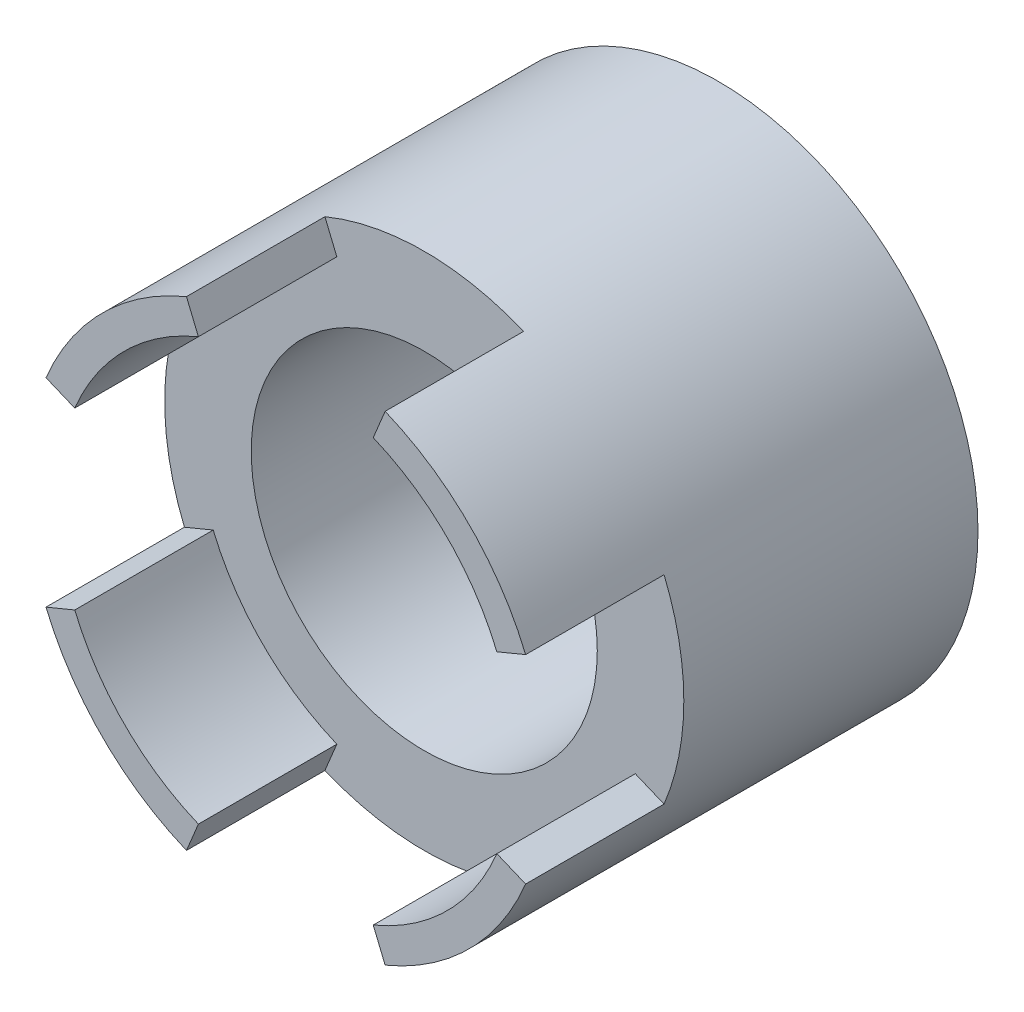
ISO-10303-21;
HEADER;
FILE_DESCRIPTION(('STEP AP214'),'2;1');
FILE_NAME('part.step','',(''),(''),'','','');
FILE_SCHEMA(('AUTOMOTIVE_DESIGN { 1 0 10303 214 1 1 1 1 }'));
ENDSEC;
DATA;
#1=APPLICATION_CONTEXT('core data for automotive mechanical design processes');
#2=APPLICATION_PROTOCOL_DEFINITION('international standard','automotive_design',2000,#1);
#3=PRODUCT_CONTEXT('',#1,'mechanical');
#4=PRODUCT('Part','Part','',(#3));
#5=PRODUCT_RELATED_PRODUCT_CATEGORY('part','',(#4));
#6=PRODUCT_DEFINITION_FORMATION('','',#4);
#7=PRODUCT_DEFINITION_CONTEXT('part definition',#1,'design');
#8=PRODUCT_DEFINITION('design','',#6,#7);
#9=PRODUCT_DEFINITION_SHAPE('','',#8);
#10=(LENGTH_UNIT() NAMED_UNIT(*) SI_UNIT(.MILLI.,.METRE.));
#11=(NAMED_UNIT(*) PLANE_ANGLE_UNIT() SI_UNIT($,.RADIAN.));
#12=(NAMED_UNIT(*) SI_UNIT($,.STERADIAN.) SOLID_ANGLE_UNIT());
#13=UNCERTAINTY_MEASURE_WITH_UNIT(LENGTH_MEASURE(1.E-05),#10,'distance_accuracy_value','');
#14=(GEOMETRIC_REPRESENTATION_CONTEXT(3) GLOBAL_UNCERTAINTY_ASSIGNED_CONTEXT((#13)) GLOBAL_UNIT_ASSIGNED_CONTEXT((#10,
#11,#12)) REPRESENTATION_CONTEXT('',''));
#15=CARTESIAN_POINT('',(0.,0.,0.));
#16=DIRECTION('',(0.,0.,1.));
#17=DIRECTION('',(1.,0.,0.));
#18=AXIS2_PLACEMENT_3D('',#15,#16,#17);
#19=CARTESIAN_POINT('',(0.,0.,-31.75));
#20=DIRECTION('',(0.,0.,1.));
#21=DIRECTION('',(1.,0.,0.));
#22=AXIS2_PLACEMENT_3D('',#19,#20,#21);
#23=CYLINDRICAL_SURFACE('',#22,16.764);
#24=CARTESIAN_POINT('',(0.,0.,0.));
#25=DIRECTION('',(0.,0.,1.));
#26=DIRECTION('',(1.,0.,0.));
#27=AXIS2_PLACEMENT_3D('',#24,#25,#26);
#28=CIRCLE('',#27,16.764);
#29=CARTESIAN_POINT('',(15.4879164830192,6.41530506016833,0.));
#30=VERTEX_POINT('',#29);
#31=CARTESIAN_POINT('',(6.41530506016838,15.4879164830192,0.));
#32=VERTEX_POINT('',#31);
#33=EDGE_CURVE('E305',#30,#32,#28,.T.);
#34=ORIENTED_EDGE('',*,*,#33,.T.);
#35=DIRECTION('',(0.,0.,1.));
#36=VECTOR('',#35,1.);
#37=CARTESIAN_POINT('',(6.41530506016838,15.4879164830192,-10.16));
#38=LINE('',#37,#36);
#39=CARTESIAN_POINT('',(6.41530506016838,15.4879164830192,-10.16));
#40=VERTEX_POINT('',#39);
#41=EDGE_CURVE('E188',#40,#32,#38,.T.);
#42=ORIENTED_EDGE('',*,*,#41,.F.);
#43=CARTESIAN_POINT('',(0.,0.,-10.16));
#44=DIRECTION('',(0.,0.,1.));
#45=DIRECTION('',(1.,0.,0.));
#46=AXIS2_PLACEMENT_3D('',#43,#44,#45);
#47=CIRCLE('',#46,16.764);
#48=CARTESIAN_POINT('',(15.4879164830192,6.41530506016834,-10.16));
#49=VERTEX_POINT('',#48);
#50=EDGE_CURVE('E292',#49,#40,#47,.T.);
#51=ORIENTED_EDGE('',*,*,#50,.F.);
#52=DIRECTION('',(0.,0.,1.));
#53=VECTOR('',#52,1.);
#54=CARTESIAN_POINT('',(15.4879164830192,6.41530506016833,-10.16));
#55=LINE('',#54,#53);
#56=EDGE_CURVE('E220',#49,#30,#55,.T.);
#57=ORIENTED_EDGE('',*,*,#56,.T.);
#58=EDGE_LOOP('',(#34,#42,#51,#57));
#59=FACE_BOUND('',#58,.T.);
#60=ADVANCED_FACE('F41',(#59),#23,.F.);
#61=CARTESIAN_POINT('',(6.41530506016828,-15.4879164830193,0.));
#62=VERTEX_POINT('',#61);
#63=CARTESIAN_POINT('',(15.4879164830192,-6.41530506016843,0.));
#64=VERTEX_POINT('',#63);
#65=EDGE_CURVE('E295',#62,#64,#28,.T.);
#66=ORIENTED_EDGE('',*,*,#65,.T.);
#67=DIRECTION('',(0.,0.,1.));
#68=VECTOR('',#67,1.);
#69=CARTESIAN_POINT('',(15.4879164830192,-6.41530506016843,-10.16));
#70=LINE('',#69,#68);
#71=CARTESIAN_POINT('',(15.4879164830192,-6.41530506016843,-10.16));
#72=VERTEX_POINT('',#71);
#73=EDGE_CURVE('E217',#72,#64,#70,.T.);
#74=ORIENTED_EDGE('',*,*,#73,.F.);
#75=CARTESIAN_POINT('',(6.41530506016829,-15.4879164830192,-10.16));
#76=VERTEX_POINT('',#75);
#77=EDGE_CURVE('E286',#76,#72,#47,.T.);
#78=ORIENTED_EDGE('',*,*,#77,.F.);
#79=DIRECTION('',(0.,0.,1.));
#80=VECTOR('',#79,1.);
#81=CARTESIAN_POINT('',(6.41530506016828,-15.4879164830193,-10.16));
#82=LINE('',#81,#80);
#83=EDGE_CURVE('E249',#76,#62,#82,.T.);
#84=ORIENTED_EDGE('',*,*,#83,.T.);
#85=EDGE_LOOP('',(#66,#74,#78,#84));
#86=FACE_BOUND('',#85,.T.);
#87=ADVANCED_FACE('F351',(#86),#23,.F.);
#88=CARTESIAN_POINT('',(-15.4879164830193,-6.41530506016822,0.));
#89=VERTEX_POINT('',#88);
#90=CARTESIAN_POINT('',(-6.41530506016848,-15.4879164830192,0.));
#91=VERTEX_POINT('',#90);
#92=EDGE_CURVE('E357',#89,#91,#28,.T.);
#93=ORIENTED_EDGE('',*,*,#92,.T.);
#94=DIRECTION('',(0.,0.,1.));
#95=VECTOR('',#94,1.);
#96=CARTESIAN_POINT('',(-6.41530506016848,-15.4879164830192,-10.16));
#97=LINE('',#96,#95);
#98=CARTESIAN_POINT('',(-6.41530506016848,-15.4879164830192,-10.16));
#99=VERTEX_POINT('',#98);
#100=EDGE_CURVE('E246',#99,#91,#97,.T.);
#101=ORIENTED_EDGE('',*,*,#100,.F.);
#102=CARTESIAN_POINT('',(-15.4879164830193,-6.41530506016823,-10.16));
#103=VERTEX_POINT('',#102);
#104=EDGE_CURVE('E341',#103,#99,#47,.T.);
#105=ORIENTED_EDGE('',*,*,#104,.F.);
#106=DIRECTION('',(0.,0.,1.));
#107=VECTOR('',#106,1.);
#108=CARTESIAN_POINT('',(-15.4879164830193,-6.41530506016822,-10.16));
#109=LINE('',#108,#107);
#110=EDGE_CURVE('E276',#103,#89,#109,.T.);
#111=ORIENTED_EDGE('',*,*,#110,.T.);
#112=EDGE_LOOP('',(#93,#101,#105,#111));
#113=FACE_BOUND('',#112,.T.);
#114=ADVANCED_FACE('F387',(#113),#23,.F.);
#115=CARTESIAN_POINT('',(0.,0.,0.));
#116=DIRECTION('',(0.,0.,1.));
#117=DIRECTION('',(1.,0.,0.));
#118=AXIS2_PLACEMENT_3D('',#115,#116,#117);
#119=PLANE('',#118);
#120=DIRECTION('',(0.38268343236509,0.923879532511286,0.));
#121=VECTOR('',#120,1.);
#122=CARTESIAN_POINT('',(7.29011938655497,17.59990509434,0.));
#123=LINE('',#122,#121);
#124=CARTESIAN_POINT('',(7.29011938655497,17.59990509434,0.));
#125=VERTEX_POINT('',#124);
#126=EDGE_CURVE('E176',#32,#125,#123,.T.);
#127=ORIENTED_EDGE('',*,*,#126,.F.);
#128=ORIENTED_EDGE('',*,*,#33,.F.);
#129=DIRECTION('',(-0.923879532511287,-0.382683432365088,0.));
#130=VECTOR('',#129,1.);
#131=CARTESIAN_POINT('',(17.59990509434,7.29011938655492,0.));
#132=LINE('',#131,#130);
#133=CARTESIAN_POINT('',(17.59990509434,7.29011938655492,0.));
#134=VERTEX_POINT('',#133);
#135=EDGE_CURVE('E206',#134,#30,#132,.T.);
#136=ORIENTED_EDGE('',*,*,#135,.F.);
#137=CARTESIAN_POINT('',(0.,0.,0.));
#138=DIRECTION('',(0.,0.,1.));
#139=DIRECTION('',(1.,0.,0.));
#140=AXIS2_PLACEMENT_3D('',#137,#138,#139);
#141=CIRCLE('',#140,19.05);
#142=EDGE_CURVE('E301',#134,#125,#141,.T.);
#143=ORIENTED_EDGE('',*,*,#142,.T.);
#144=EDGE_LOOP('',(#127,#128,#136,#143));
#145=FACE_BOUND('',#144,.T.);
#146=ADVANCED_FACE('F403',(#145),#119,.T.);
#147=DIRECTION('',(0.923879532511285,-0.382683432365094,0.));
#148=VECTOR('',#147,1.);
#149=CARTESIAN_POINT('',(17.59990509434,-7.29011938655504,0.));
#150=LINE('',#149,#148);
#151=CARTESIAN_POINT('',(17.59990509434,-7.29011938655504,0.));
#152=VERTEX_POINT('',#151);
#153=EDGE_CURVE('E198',#64,#152,#150,.T.);
#154=ORIENTED_EDGE('',*,*,#153,.F.);
#155=ORIENTED_EDGE('',*,*,#65,.F.);
#156=DIRECTION('',(-0.382683432365085,0.923879532511289,0.));
#157=VECTOR('',#156,1.);
#158=CARTESIAN_POINT('',(7.29011938655486,-17.5999050943401,0.));
#159=LINE('',#158,#157);
#160=CARTESIAN_POINT('',(7.29011938655486,-17.5999050943401,0.));
#161=VERTEX_POINT('',#160);
#162=EDGE_CURVE('E237',#161,#62,#159,.T.);
#163=ORIENTED_EDGE('',*,*,#162,.F.);
#164=EDGE_CURVE('E308',#161,#152,#141,.T.);
#165=ORIENTED_EDGE('',*,*,#164,.T.);
#166=EDGE_LOOP('',(#154,#155,#163,#165));
#167=FACE_BOUND('',#166,.T.);
#168=ADVANCED_FACE('F355',(#167),#119,.T.);
#169=DIRECTION('',(-0.382683432365097,-0.923879532511284,0.));
#170=VECTOR('',#169,1.);
#171=CARTESIAN_POINT('',(-7.2901193865551,-17.59990509434,0.));
#172=LINE('',#171,#170);
#173=CARTESIAN_POINT('',(-7.2901193865551,-17.59990509434,0.));
#174=VERTEX_POINT('',#173);
#175=EDGE_CURVE('E229',#91,#174,#172,.T.);
#176=ORIENTED_EDGE('',*,*,#175,.F.);
#177=ORIENTED_EDGE('',*,*,#92,.F.);
#178=DIRECTION('',(0.92387953251129,0.382683432365082,0.));
#179=VECTOR('',#178,1.);
#180=CARTESIAN_POINT('',(-17.5999050943401,-7.29011938655479,0.));
#181=LINE('',#180,#179);
#182=CARTESIAN_POINT('',(-17.5999050943401,-7.29011938655479,0.));
#183=VERTEX_POINT('',#182);
#184=EDGE_CURVE('E266',#183,#89,#181,.T.);
#185=ORIENTED_EDGE('',*,*,#184,.F.);
#186=EDGE_CURVE('E317',#183,#174,#141,.T.);
#187=ORIENTED_EDGE('',*,*,#186,.T.);
#188=EDGE_LOOP('',(#176,#177,#185,#187));
#189=FACE_BOUND('',#188,.T.);
#190=ADVANCED_FACE('F330',(#189),#119,.T.);
#191=CARTESIAN_POINT('',(0.,0.,-31.75));
#192=DIRECTION('',(0.,0.,1.));
#193=DIRECTION('',(1.,0.,0.));
#194=AXIS2_PLACEMENT_3D('',#191,#192,#193);
#195=CIRCLE('',#194,16.764);
#196=CARTESIAN_POINT('',(16.764,0.,-31.75));
#197=VERTEX_POINT('',#196);
#198=EDGE_CURVE('E297',#197,#197,#195,.T.);
#199=ORIENTED_EDGE('',*,*,#198,.F.);
#200=EDGE_LOOP('',(#199));
#201=FACE_BOUND('',#200,.T.);
#202=CARTESIAN_POINT('',(0.,0.,-30.48));
#203=DIRECTION('',(0.,0.,1.));
#204=DIRECTION('',(1.,0.,0.));
#205=AXIS2_PLACEMENT_3D('',#202,#203,#204);
#206=CIRCLE('',#205,16.764);
#207=CARTESIAN_POINT('',(16.764,0.,-30.48));
#208=VERTEX_POINT('',#207);
#209=EDGE_CURVE('E11',#208,#208,#206,.F.);
#210=ORIENTED_EDGE('',*,*,#209,.F.);
#211=EDGE_LOOP('',(#210));
#212=FACE_BOUND('',#211,.T.);
#213=ADVANCED_FACE('F389',(#201,#212),#23,.F.);
#214=CARTESIAN_POINT('',(-6.4153050601684,15.4879164830192,-10.16));
#215=VERTEX_POINT('',#214);
#216=CARTESIAN_POINT('',(-15.4879164830191,6.41530506016854,-10.16));
#217=VERTEX_POINT('',#216);
#218=EDGE_CURVE('E296',#215,#217,#47,.T.);
#219=ORIENTED_EDGE('',*,*,#218,.F.);
#220=DIRECTION('',(0.,0.,1.));
#221=VECTOR('',#220,1.);
#222=CARTESIAN_POINT('',(-6.41530506016838,15.4879164830192,-10.16));
#223=LINE('',#222,#221);
#224=CARTESIAN_POINT('',(-6.41530506016838,15.4879164830192,0.));
#225=VERTEX_POINT('',#224);
#226=EDGE_CURVE('E162',#215,#225,#223,.T.);
#227=ORIENTED_EDGE('',*,*,#226,.T.);
#228=CARTESIAN_POINT('',(-15.4879164830191,6.41530506016854,0.));
#229=VERTEX_POINT('',#228);
#230=EDGE_CURVE('E309',#225,#229,#28,.T.);
#231=ORIENTED_EDGE('',*,*,#230,.T.);
#232=DIRECTION('',(0.,0.,1.));
#233=VECTOR('',#232,1.);
#234=CARTESIAN_POINT('',(-15.4879164830191,6.41530506016854,-10.16));
#235=LINE('',#234,#233);
#236=EDGE_CURVE('E273',#217,#229,#235,.T.);
#237=ORIENTED_EDGE('',*,*,#236,.F.);
#238=EDGE_LOOP('',(#219,#227,#231,#237));
#239=FACE_BOUND('',#238,.T.);
#240=ADVANCED_FACE('F43',(#239),#23,.F.);
#241=CARTESIAN_POINT('',(0.,0.,-31.75));
#242=DIRECTION('',(0.,0.,1.));
#243=DIRECTION('',(1.,0.,0.));
#244=AXIS2_PLACEMENT_3D('',#241,#242,#243);
#245=CYLINDRICAL_SURFACE('',#244,19.05);
#246=DIRECTION('',(0.,0.,1.));
#247=VECTOR('',#246,1.);
#248=CARTESIAN_POINT('',(7.29011938655497,17.59990509434,-10.16));
#249=LINE('',#248,#247);
#250=CARTESIAN_POINT('',(7.29011938655497,17.59990509434,-10.16));
#251=VERTEX_POINT('',#250);
#252=EDGE_CURVE('E291',#251,#125,#249,.T.);
#253=ORIENTED_EDGE('',*,*,#252,.T.);
#254=ORIENTED_EDGE('',*,*,#142,.F.);
#255=DIRECTION('',(0.,0.,1.));
#256=VECTOR('',#255,1.);
#257=CARTESIAN_POINT('',(17.59990509434,7.29011938655492,-10.16));
#258=LINE('',#257,#256);
#259=CARTESIAN_POINT('',(17.59990509434,7.29011938655492,-10.16));
#260=VERTEX_POINT('',#259);
#261=EDGE_CURVE('E205',#260,#134,#258,.T.);
#262=ORIENTED_EDGE('',*,*,#261,.F.);
#263=CARTESIAN_POINT('',(0.,0.,-10.16));
#264=DIRECTION('',(0.,0.,1.));
#265=DIRECTION('',(-1.,0.,0.));
#266=AXIS2_PLACEMENT_3D('',#263,#264,#265);
#267=CIRCLE('',#266,19.05);
#268=CARTESIAN_POINT('',(17.59990509434,-7.29011938655504,-10.16));
#269=VERTEX_POINT('',#268);
#270=EDGE_CURVE('E193',#269,#260,#267,.T.);
#271=ORIENTED_EDGE('',*,*,#270,.F.);
#272=DIRECTION('',(0.,0.,1.));
#273=VECTOR('',#272,1.);
#274=CARTESIAN_POINT('',(17.59990509434,-7.29011938655504,-10.16));
#275=LINE('',#274,#273);
#276=EDGE_CURVE('E212',#269,#152,#275,.T.);
#277=ORIENTED_EDGE('',*,*,#276,.T.);
#278=ORIENTED_EDGE('',*,*,#164,.F.);
#279=DIRECTION('',(0.,0.,1.));
#280=VECTOR('',#279,1.);
#281=CARTESIAN_POINT('',(7.29011938655486,-17.5999050943401,-10.16));
#282=LINE('',#281,#280);
#283=CARTESIAN_POINT('',(7.29011938655486,-17.5999050943401,-10.16));
#284=VERTEX_POINT('',#283);
#285=EDGE_CURVE('E236',#284,#161,#282,.T.);
#286=ORIENTED_EDGE('',*,*,#285,.F.);
#287=CARTESIAN_POINT('',(0.,0.,-10.16));
#288=DIRECTION('',(0.,0.,1.));
#289=DIRECTION('',(-1.,0.,0.));
#290=AXIS2_PLACEMENT_3D('',#287,#288,#289);
#291=CIRCLE('',#290,19.05);
#292=CARTESIAN_POINT('',(-7.2901193865551,-17.59990509434,-10.16));
#293=VERTEX_POINT('',#292);
#294=EDGE_CURVE('E226',#293,#284,#291,.T.);
#295=ORIENTED_EDGE('',*,*,#294,.F.);
#296=DIRECTION('',(0.,0.,1.));
#297=VECTOR('',#296,1.);
#298=CARTESIAN_POINT('',(-7.2901193865551,-17.59990509434,-10.16));
#299=LINE('',#298,#297);
#300=EDGE_CURVE('E209',#293,#174,#299,.T.);
#301=ORIENTED_EDGE('',*,*,#300,.T.);
#302=ORIENTED_EDGE('',*,*,#186,.F.);
#303=DIRECTION('',(0.,0.,1.));
#304=VECTOR('',#303,1.);
#305=CARTESIAN_POINT('',(-17.5999050943401,-7.29011938655479,-10.16));
#306=LINE('',#305,#304);
#307=CARTESIAN_POINT('',(-17.5999050943401,-7.29011938655479,-10.16));
#308=VERTEX_POINT('',#307);
#309=EDGE_CURVE('E265',#308,#183,#306,.T.);
#310=ORIENTED_EDGE('',*,*,#309,.F.);
#311=CARTESIAN_POINT('',(0.,0.,-10.16));
#312=DIRECTION('',(0.,0.,1.));
#313=DIRECTION('',(-1.,0.,0.));
#314=AXIS2_PLACEMENT_3D('',#311,#312,#313);
#315=CIRCLE('',#314,19.05);
#316=CARTESIAN_POINT('',(-17.5999050943399,7.29011938655516,-10.16));
#317=VERTEX_POINT('',#316);
#318=EDGE_CURVE('E255',#317,#308,#315,.T.);
#319=ORIENTED_EDGE('',*,*,#318,.F.);
#320=DIRECTION('',(0.,0.,1.));
#321=VECTOR('',#320,1.);
#322=CARTESIAN_POINT('',(-17.5999050943399,7.29011938655516,-10.16));
#323=LINE('',#322,#321);
#324=CARTESIAN_POINT('',(-17.5999050943399,7.29011938655516,0.));
#325=VERTEX_POINT('',#324);
#326=EDGE_CURVE('E240',#317,#325,#323,.T.);
#327=ORIENTED_EDGE('',*,*,#326,.T.);
#328=CARTESIAN_POINT('',(-7.29011938655498,17.59990509434,0.));
#329=VERTEX_POINT('',#328);
#330=EDGE_CURVE('E183',#329,#325,#141,.T.);
#331=ORIENTED_EDGE('',*,*,#330,.F.);
#332=DIRECTION('',(0.,0.,1.));
#333=VECTOR('',#332,1.);
#334=CARTESIAN_POINT('',(-7.29011938655498,17.59990509434,-10.16));
#335=LINE('',#334,#333);
#336=CARTESIAN_POINT('',(-7.29011938655498,17.59990509434,-10.16));
#337=VERTEX_POINT('',#336);
#338=EDGE_CURVE('E159',#337,#329,#335,.T.);
#339=ORIENTED_EDGE('',*,*,#338,.F.);
#340=CARTESIAN_POINT('',(0.,0.,-10.16));
#341=DIRECTION('',(0.,0.,1.));
#342=DIRECTION('',(-1.,0.,0.));
#343=AXIS2_PLACEMENT_3D('',#340,#341,#342);
#344=CIRCLE('',#343,19.05);
#345=EDGE_CURVE('E167',#251,#337,#344,.T.);
#346=ORIENTED_EDGE('',*,*,#345,.F.);
#347=EDGE_LOOP('',(#253,#254,#262,#271,#277,#278,#286,#295,#301,#302,#310,#319,#327,#331,#339,#346));
#348=FACE_BOUND('',#347,.T.);
#349=CARTESIAN_POINT('',(0.,0.,-31.75));
#350=DIRECTION('',(0.,0.,1.));
#351=DIRECTION('',(1.,0.,0.));
#352=AXIS2_PLACEMENT_3D('',#349,#350,#351);
#353=CIRCLE('',#352,19.05);
#354=CARTESIAN_POINT('',(19.05,0.,-31.75));
#355=VERTEX_POINT('',#354);
#356=EDGE_CURVE('E50',#355,#355,#353,.T.);
#357=ORIENTED_EDGE('',*,*,#356,.T.);
#358=EDGE_LOOP('',(#357));
#359=FACE_BOUND('',#358,.T.);
#360=ADVANCED_FACE('F179',(#348,#359),#245,.T.);
#361=CARTESIAN_POINT('',(0.,0.,-31.75));
#362=DIRECTION('',(0.,0.,1.));
#363=DIRECTION('',(1.,0.,0.));
#364=AXIS2_PLACEMENT_3D('',#361,#362,#363);
#365=PLANE('',#364);
#366=ORIENTED_EDGE('',*,*,#198,.T.);
#367=EDGE_LOOP('',(#366));
#368=FACE_BOUND('',#367,.T.);
#369=ORIENTED_EDGE('',*,*,#356,.F.);
#370=EDGE_LOOP('',(#369));
#371=FACE_BOUND('',#370,.T.);
#372=ADVANCED_FACE('F394',(#368,#371),#365,.F.);
#373=DIRECTION('',(0.382683432365092,-0.923879532511286,0.));
#374=VECTOR('',#373,1.);
#375=CARTESIAN_POINT('',(-7.29011938655498,17.59990509434,0.));
#376=LINE('',#375,#374);
#377=EDGE_CURVE('E216',#329,#225,#376,.T.);
#378=ORIENTED_EDGE('',*,*,#377,.F.);
#379=ORIENTED_EDGE('',*,*,#330,.T.);
#380=DIRECTION('',(-0.923879532511283,0.3826834323651,0.));
#381=VECTOR('',#380,1.);
#382=CARTESIAN_POINT('',(-17.5999050943399,7.29011938655516,0.));
#383=LINE('',#382,#381);
#384=EDGE_CURVE('E258',#229,#325,#383,.T.);
#385=ORIENTED_EDGE('',*,*,#384,.F.);
#386=ORIENTED_EDGE('',*,*,#230,.F.);
#387=EDGE_LOOP('',(#378,#379,#385,#386));
#388=FACE_BOUND('',#387,.T.);
#389=ADVANCED_FACE('F366',(#388),#119,.T.);
#390=CARTESIAN_POINT('',(0.,0.,-30.48));
#391=DIRECTION('',(0.,0.,1.));
#392=DIRECTION('',(1.,0.,0.));
#393=AXIS2_PLACEMENT_3D('',#390,#391,#392);
#394=PLANE('',#393);
#395=CARTESIAN_POINT('',(0.,0.,-30.48));
#396=DIRECTION('',(0.,0.,1.));
#397=DIRECTION('',(1.,0.,0.));
#398=AXIS2_PLACEMENT_3D('',#395,#396,#397);
#399=CIRCLE('',#398,12.7);
#400=CARTESIAN_POINT('',(12.7,0.,-30.48));
#401=VERTEX_POINT('',#400);
#402=EDGE_CURVE('E282',#401,#401,#399,.T.);
#403=ORIENTED_EDGE('',*,*,#402,.T.);
#404=EDGE_LOOP('',(#403));
#405=FACE_BOUND('',#404,.T.);
#406=ORIENTED_EDGE('',*,*,#209,.T.);
#407=EDGE_LOOP('',(#406));
#408=FACE_BOUND('',#407,.T.);
#409=ADVANCED_FACE('F412',(#405,#408),#394,.F.);
#410=CARTESIAN_POINT('',(0.,0.,-10.16));
#411=DIRECTION('',(0.,0.,1.));
#412=DIRECTION('',(1.,0.,0.));
#413=AXIS2_PLACEMENT_3D('',#410,#411,#412);
#414=PLANE('',#413);
#415=CARTESIAN_POINT('',(0.,0.,-10.16));
#416=DIRECTION('',(0.,0.,1.));
#417=DIRECTION('',(1.,0.,0.));
#418=AXIS2_PLACEMENT_3D('',#415,#416,#417);
#419=CIRCLE('',#418,12.7);
#420=CARTESIAN_POINT('',(12.7,0.,-10.16));
#421=VERTEX_POINT('',#420);
#422=EDGE_CURVE('E287',#421,#421,#419,.T.);
#423=ORIENTED_EDGE('',*,*,#422,.F.);
#424=EDGE_LOOP('',(#423));
#425=FACE_BOUND('',#424,.T.);
#426=ORIENTED_EDGE('',*,*,#50,.T.);
#427=DIRECTION('',(0.38268343236509,0.923879532511286,0.));
#428=VECTOR('',#427,1.);
#429=CARTESIAN_POINT('',(7.29011938655497,17.59990509434,-10.16));
#430=LINE('',#429,#428);
#431=EDGE_CURVE('E166',#40,#251,#430,.T.);
#432=ORIENTED_EDGE('',*,*,#431,.T.);
#433=ORIENTED_EDGE('',*,*,#345,.T.);
#434=DIRECTION('',(0.382683432365092,-0.923879532511286,0.));
#435=VECTOR('',#434,1.);
#436=CARTESIAN_POINT('',(-7.29011938655498,17.59990509434,-10.16));
#437=LINE('',#436,#435);
#438=EDGE_CURVE('E155',#337,#215,#437,.T.);
#439=ORIENTED_EDGE('',*,*,#438,.T.);
#440=ORIENTED_EDGE('',*,*,#218,.T.);
#441=DIRECTION('',(-0.923879532511283,0.3826834323651,0.));
#442=VECTOR('',#441,1.);
#443=CARTESIAN_POINT('',(-17.5999050943399,7.29011938655516,-10.16));
#444=LINE('',#443,#442);
#445=EDGE_CURVE('E261',#217,#317,#444,.T.);
#446=ORIENTED_EDGE('',*,*,#445,.T.);
#447=ORIENTED_EDGE('',*,*,#318,.T.);
#448=DIRECTION('',(0.92387953251129,0.382683432365082,0.));
#449=VECTOR('',#448,1.);
#450=CARTESIAN_POINT('',(-17.5999050943401,-7.29011938655479,-10.16));
#451=LINE('',#450,#449);
#452=EDGE_CURVE('E64',#308,#103,#451,.T.);
#453=ORIENTED_EDGE('',*,*,#452,.T.);
#454=ORIENTED_EDGE('',*,*,#104,.T.);
#455=DIRECTION('',(-0.382683432365097,-0.923879532511284,0.));
#456=VECTOR('',#455,1.);
#457=CARTESIAN_POINT('',(-7.2901193865551,-17.59990509434,-10.16));
#458=LINE('',#457,#456);
#459=EDGE_CURVE('E232',#99,#293,#458,.T.);
#460=ORIENTED_EDGE('',*,*,#459,.T.);
#461=ORIENTED_EDGE('',*,*,#294,.T.);
#462=DIRECTION('',(-0.382683432365085,0.923879532511289,0.));
#463=VECTOR('',#462,1.);
#464=CARTESIAN_POINT('',(7.29011938655486,-17.5999050943401,-10.16));
#465=LINE('',#464,#463);
#466=EDGE_CURVE('E57',#284,#76,#465,.T.);
#467=ORIENTED_EDGE('',*,*,#466,.T.);
#468=ORIENTED_EDGE('',*,*,#77,.T.);
#469=DIRECTION('',(0.923879532511285,-0.382683432365094,0.));
#470=VECTOR('',#469,1.);
#471=CARTESIAN_POINT('',(17.59990509434,-7.29011938655504,-10.16));
#472=LINE('',#471,#470);
#473=EDGE_CURVE('E201',#72,#269,#472,.T.);
#474=ORIENTED_EDGE('',*,*,#473,.T.);
#475=ORIENTED_EDGE('',*,*,#270,.T.);
#476=DIRECTION('',(-0.923879532511287,-0.382683432365088,0.));
#477=VECTOR('',#476,1.);
#478=CARTESIAN_POINT('',(17.59990509434,7.29011938655492,-10.16));
#479=LINE('',#478,#477);
#480=EDGE_CURVE('E197',#260,#49,#479,.T.);
#481=ORIENTED_EDGE('',*,*,#480,.T.);
#482=EDGE_LOOP('',(#426,#432,#433,#439,#440,#446,#447,#453,#454,#460,#461,#467,#468,#474,#475,#481));
#483=FACE_BOUND('',#482,.T.);
#484=ADVANCED_FACE('F172',(#425,#483),#414,.T.);
#485=CARTESIAN_POINT('',(0.,0.,-30.48));
#486=DIRECTION('',(0.,0.,1.));
#487=DIRECTION('',(1.,0.,0.));
#488=AXIS2_PLACEMENT_3D('',#485,#486,#487);
#489=CYLINDRICAL_SURFACE('',#488,12.7);
#490=ORIENTED_EDGE('',*,*,#402,.F.);
#491=EDGE_LOOP('',(#490));
#492=FACE_BOUND('',#491,.T.);
#493=ORIENTED_EDGE('',*,*,#422,.T.);
#494=EDGE_LOOP('',(#493));
#495=FACE_BOUND('',#494,.T.);
#496=ADVANCED_FACE('F371',(#492,#495),#489,.F.);
#497=CARTESIAN_POINT('',(-17.5999050943399,7.29011938655516,-10.16));
#498=DIRECTION('',(0.3826834323651,0.923879532511282,0.));
#499=DIRECTION('',(-0.923879532511282,0.3826834323651,0.));
#500=AXIS2_PLACEMENT_3D('',#497,#498,#499);
#501=PLANE('',#500);
#502=ORIENTED_EDGE('',*,*,#384,.T.);
#503=ORIENTED_EDGE('',*,*,#326,.F.);
#504=ORIENTED_EDGE('',*,*,#445,.F.);
#505=ORIENTED_EDGE('',*,*,#236,.T.);
#506=EDGE_LOOP('',(#502,#503,#504,#505));
#507=FACE_BOUND('',#506,.T.);
#508=ADVANCED_FACE('F368',(#507),#501,.F.);
#509=CARTESIAN_POINT('',(-17.5999050943401,-7.29011938655479,-10.16));
#510=DIRECTION('',(0.382683432365082,-0.92387953251129,0.));
#511=DIRECTION('',(0.92387953251129,0.382683432365082,0.));
#512=AXIS2_PLACEMENT_3D('',#509,#510,#511);
#513=PLANE('',#512);
#514=ORIENTED_EDGE('',*,*,#184,.T.);
#515=ORIENTED_EDGE('',*,*,#110,.F.);
#516=ORIENTED_EDGE('',*,*,#452,.F.);
#517=ORIENTED_EDGE('',*,*,#309,.T.);
#518=EDGE_LOOP('',(#514,#515,#516,#517));
#519=FACE_BOUND('',#518,.T.);
#520=ADVANCED_FACE('F370',(#519),#513,.F.);
#521=CARTESIAN_POINT('',(-7.2901193865551,-17.59990509434,-10.16));
#522=DIRECTION('',(-0.923879532511284,0.382683432365097,0.));
#523=DIRECTION('',(-0.382683432365097,-0.923879532511284,0.));
#524=AXIS2_PLACEMENT_3D('',#521,#522,#523);
#525=PLANE('',#524);
#526=ORIENTED_EDGE('',*,*,#175,.T.);
#527=ORIENTED_EDGE('',*,*,#300,.F.);
#528=ORIENTED_EDGE('',*,*,#459,.F.);
#529=ORIENTED_EDGE('',*,*,#100,.T.);
#530=EDGE_LOOP('',(#526,#527,#528,#529));
#531=FACE_BOUND('',#530,.T.);
#532=ADVANCED_FACE('F338',(#531),#525,.F.);
#533=CARTESIAN_POINT('',(7.29011938655486,-17.5999050943401,-10.16));
#534=DIRECTION('',(0.923879532511289,0.382683432365085,0.));
#535=DIRECTION('',(-0.382683432365085,0.923879532511289,0.));
#536=AXIS2_PLACEMENT_3D('',#533,#534,#535);
#537=PLANE('',#536);
#538=ORIENTED_EDGE('',*,*,#162,.T.);
#539=ORIENTED_EDGE('',*,*,#83,.F.);
#540=ORIENTED_EDGE('',*,*,#466,.F.);
#541=ORIENTED_EDGE('',*,*,#285,.T.);
#542=EDGE_LOOP('',(#538,#539,#540,#541));
#543=FACE_BOUND('',#542,.T.);
#544=ADVANCED_FACE('F515',(#543),#537,.F.);
#545=CARTESIAN_POINT('',(17.59990509434,-7.29011938655504,-10.16));
#546=DIRECTION('',(-0.382683432365094,-0.923879532511285,0.));
#547=DIRECTION('',(0.923879532511285,-0.382683432365094,0.));
#548=AXIS2_PLACEMENT_3D('',#545,#546,#547);
#549=PLANE('',#548);
#550=ORIENTED_EDGE('',*,*,#153,.T.);
#551=ORIENTED_EDGE('',*,*,#276,.F.);
#552=ORIENTED_EDGE('',*,*,#473,.F.);
#553=ORIENTED_EDGE('',*,*,#73,.T.);
#554=EDGE_LOOP('',(#550,#551,#552,#553));
#555=FACE_BOUND('',#554,.T.);
#556=ADVANCED_FACE('F354',(#555),#549,.F.);
#557=CARTESIAN_POINT('',(17.59990509434,7.29011938655492,-10.16));
#558=DIRECTION('',(-0.382683432365088,0.923879532511287,0.));
#559=DIRECTION('',(-0.923879532511287,-0.382683432365088,0.));
#560=AXIS2_PLACEMENT_3D('',#557,#558,#559);
#561=PLANE('',#560);
#562=ORIENTED_EDGE('',*,*,#135,.T.);
#563=ORIENTED_EDGE('',*,*,#56,.F.);
#564=ORIENTED_EDGE('',*,*,#480,.F.);
#565=ORIENTED_EDGE('',*,*,#261,.T.);
#566=EDGE_LOOP('',(#562,#563,#564,#565));
#567=FACE_BOUND('',#566,.T.);
#568=ADVANCED_FACE('F530',(#567),#561,.F.);
#569=CARTESIAN_POINT('',(7.29011938655497,17.59990509434,-10.16));
#570=DIRECTION('',(0.923879532511286,-0.38268343236509,0.));
#571=DIRECTION('',(0.382683432365091,0.923879532511287,0.));
#572=AXIS2_PLACEMENT_3D('',#569,#570,#571);
#573=PLANE('',#572);
#574=ORIENTED_EDGE('',*,*,#126,.T.);
#575=ORIENTED_EDGE('',*,*,#252,.F.);
#576=ORIENTED_EDGE('',*,*,#431,.F.);
#577=ORIENTED_EDGE('',*,*,#41,.T.);
#578=EDGE_LOOP('',(#574,#575,#576,#577));
#579=FACE_BOUND('',#578,.T.);
#580=ADVANCED_FACE('F538',(#579),#573,.F.);
#581=CARTESIAN_POINT('',(-7.29011938655498,17.59990509434,-10.16));
#582=DIRECTION('',(-0.923879532511286,-0.382683432365092,0.));
#583=DIRECTION('',(0.382683432365092,-0.923879532511286,0.));
#584=AXIS2_PLACEMENT_3D('',#581,#582,#583);
#585=PLANE('',#584);
#586=ORIENTED_EDGE('',*,*,#377,.T.);
#587=ORIENTED_EDGE('',*,*,#226,.F.);
#588=ORIENTED_EDGE('',*,*,#438,.F.);
#589=ORIENTED_EDGE('',*,*,#338,.T.);
#590=EDGE_LOOP('',(#586,#587,#588,#589));
#591=FACE_BOUND('',#590,.T.);
#592=ADVANCED_FACE('F157',(#591),#585,.F.);
#593=CLOSED_SHELL('',(#60,#87,#114,#146,#168,#190,#213,#240,#360,#372,#389,#409,#484,#496,#508,
#520,#532,#544,#556,#568,#580,#592));
#594=MANIFOLD_SOLID_BREP('B2',#593);
#595=ADVANCED_BREP_SHAPE_REPRESENTATION('',(#18,#594),#14);
#596=SHAPE_DEFINITION_REPRESENTATION(#9,#595);
ENDSEC;
END-ISO-10303-21;
